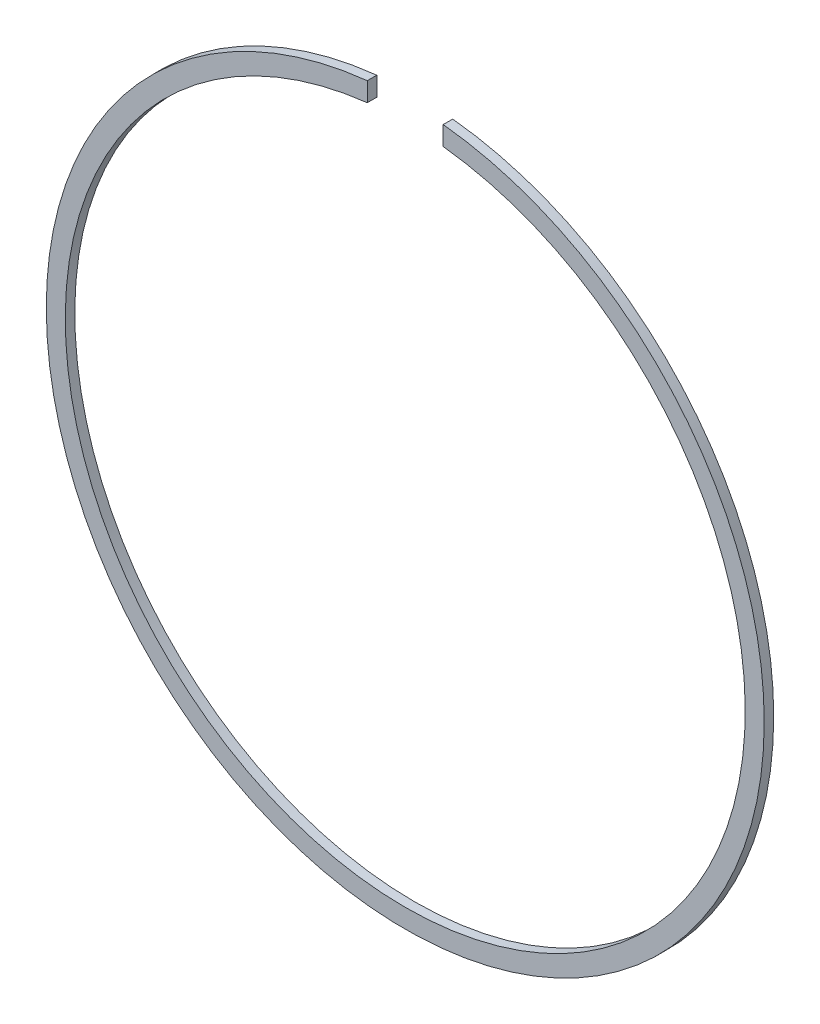
ISO-10303-21;
HEADER;
FILE_DESCRIPTION(('STEP AP214'),'2;1');
FILE_NAME('part.step','',(''),(''),'','','');
FILE_SCHEMA(('AUTOMOTIVE_DESIGN { 1 0 10303 214 1 1 1 1 }'));
ENDSEC;
DATA;
#1=APPLICATION_CONTEXT('core data for automotive mechanical design processes');
#2=APPLICATION_PROTOCOL_DEFINITION('international standard','automotive_design',2000,#1);
#3=PRODUCT_CONTEXT('',#1,'mechanical');
#4=PRODUCT('Part','Part','',(#3));
#5=PRODUCT_RELATED_PRODUCT_CATEGORY('part','',(#4));
#6=PRODUCT_DEFINITION_FORMATION('','',#4);
#7=PRODUCT_DEFINITION_CONTEXT('part definition',#1,'design');
#8=PRODUCT_DEFINITION('design','',#6,#7);
#9=PRODUCT_DEFINITION_SHAPE('','',#8);
#10=(LENGTH_UNIT() NAMED_UNIT(*) SI_UNIT(.MILLI.,.METRE.));
#11=(NAMED_UNIT(*) PLANE_ANGLE_UNIT() SI_UNIT($,.RADIAN.));
#12=(NAMED_UNIT(*) SI_UNIT($,.STERADIAN.) SOLID_ANGLE_UNIT());
#13=UNCERTAINTY_MEASURE_WITH_UNIT(LENGTH_MEASURE(1.E-05),#10,'distance_accuracy_value','');
#14=(GEOMETRIC_REPRESENTATION_CONTEXT(3) GLOBAL_UNCERTAINTY_ASSIGNED_CONTEXT((#13)) GLOBAL_UNIT_ASSIGNED_CONTEXT((#10,
#11,#12)) REPRESENTATION_CONTEXT('',''));
#15=CARTESIAN_POINT('',(0.,0.,0.));
#16=DIRECTION('',(0.,0.,1.));
#17=DIRECTION('',(1.,0.,0.));
#18=AXIS2_PLACEMENT_3D('',#15,#16,#17);
#19=CARTESIAN_POINT('',(2.,18.290899615,0.25));
#20=DIRECTION('',(1.,0.,0.));
#21=DIRECTION('',(0.,1.,0.));
#22=AXIS2_PLACEMENT_3D('',#19,#20,#21);
#23=PLANE('',#22);
#24=DIRECTION('',(5.695634942276E-10,-1.,0.));
#25=VECTOR('',#24,1.);
#26=CARTESIAN_POINT('',(1.999999999632,18.79388198295,0.));
#27=LINE('',#26,#25);
#28=CARTESIAN_POINT('',(1.999999999399,18.79388198331,0.));
#29=VERTEX_POINT('',#28);
#30=CARTESIAN_POINT('',(2.000000000205,17.78791724727,0.));
#31=VERTEX_POINT('',#30);
#32=EDGE_CURVE('E69',#29,#31,#27,.T.);
#33=ORIENTED_EDGE('',*,*,#32,.T.);
#34=DIRECTION('',(0.,0.,1.));
#35=VECTOR('',#34,1.);
#36=CARTESIAN_POINT('',(2.000000000205,17.78791724727,0.));
#37=LINE('',#36,#35);
#38=CARTESIAN_POINT('',(2.000000000291,17.78791724736,0.5));
#39=VERTEX_POINT('',#38);
#40=EDGE_CURVE('E11',#31,#39,#37,.T.);
#41=ORIENTED_EDGE('',*,*,#40,.T.);
#42=DIRECTION('',(5.69563935673E-10,-1.,0.));
#43=VECTOR('',#42,1.);
#44=CARTESIAN_POINT('',(1.999999999632,18.79388198297,0.5));
#45=LINE('',#44,#43);
#46=CARTESIAN_POINT('',(1.999999999399,18.79388198331,0.5));
#47=VERTEX_POINT('',#46);
#48=EDGE_CURVE('E27',#47,#39,#45,.T.);
#49=ORIENTED_EDGE('',*,*,#48,.F.);
#50=DIRECTION('',(0.,-3.780087354244E-11,-1.));
#51=VECTOR('',#50,1.);
#52=CARTESIAN_POINT('',(1.999999999632,18.79388198297,0.5));
#53=LINE('',#52,#51);
#54=EDGE_CURVE('E67',#47,#29,#53,.T.);
#55=ORIENTED_EDGE('',*,*,#54,.T.);
#56=EDGE_LOOP('',(#33,#41,#49,#55));
#57=FACE_BOUND('',#56,.T.);
#58=ADVANCED_FACE('F17',(#57),#23,.F.);
#59=CARTESIAN_POINT('',(0.,-0.05956264974822,0.5));
#60=DIRECTION('',(0.,0.,1.));
#61=DIRECTION('',(1.,0.,0.));
#62=AXIS2_PLACEMENT_3D('',#59,#60,#61);
#63=PLANE('',#62);
#64=CARTESIAN_POINT('',(0.,0.,0.5));
#65=DIRECTION('',(0.,0.,-1.));
#66=DIRECTION('',(-1.,4.55520560277E-11,0.));
#67=AXIS2_PLACEMENT_3D('',#64,#65,#66);
#68=CIRCLE('',#67,18.9);
#69=CARTESIAN_POINT('',(-2.00000000128,18.79388198265,0.5));
#70=VERTEX_POINT('',#69);
#71=EDGE_CURVE('E73',#47,#70,#68,.T.);
#72=ORIENTED_EDGE('',*,*,#71,.F.);
#73=ORIENTED_EDGE('',*,*,#48,.T.);
#74=CARTESIAN_POINT('',(0.,0.,0.5));
#75=DIRECTION('',(0.,0.,1.));
#76=DIRECTION('',(-1.,6.335535370704E-11,0.));
#77=AXIS2_PLACEMENT_3D('',#74,#75,#76);
#78=CIRCLE('',#77,17.9);
#79=CARTESIAN_POINT('',(-1.999999999121,17.78791724746,0.5));
#80=VERTEX_POINT('',#79);
#81=EDGE_CURVE('E40',#80,#39,#78,.T.);
#82=ORIENTED_EDGE('',*,*,#81,.F.);
#83=DIRECTION('',(-2.146078949012E-09,1.,0.));
#84=VECTOR('',#83,1.);
#85=CARTESIAN_POINT('',(-1.999999999121,17.78791724746,0.5));
#86=LINE('',#85,#84);
#87=EDGE_CURVE('E92',#80,#70,#86,.T.);
#88=ORIENTED_EDGE('',*,*,#87,.T.);
#89=EDGE_LOOP('',(#72,#73,#82,#88));
#90=FACE_BOUND('',#89,.T.);
#91=ADVANCED_FACE('F19',(#90),#63,.T.);
#92=CARTESIAN_POINT('',(0.,0.,0.5));
#93=DIRECTION('',(0.,0.,-1.));
#94=DIRECTION('',(-1.,0.,0.));
#95=AXIS2_PLACEMENT_3D('',#92,#93,#94);
#96=CYLINDRICAL_SURFACE('',#95,18.9);
#97=ORIENTED_EDGE('',*,*,#71,.T.);
#98=DIRECTION('',(0.,-2.911804131145E-11,1.));
#99=VECTOR('',#98,1.);
#100=CARTESIAN_POINT('',(-2.00000000128,18.79388198266,0.));
#101=LINE('',#100,#99);
#102=CARTESIAN_POINT('',(-2.00000000128,18.79388198266,0.));
#103=VERTEX_POINT('',#102);
#104=EDGE_CURVE('E80',#103,#70,#101,.T.);
#105=ORIENTED_EDGE('',*,*,#104,.F.);
#106=CARTESIAN_POINT('',(0.,0.,0.));
#107=DIRECTION('',(0.,0.,1.));
#108=DIRECTION('',(1.,-6.932067721106E-11,0.));
#109=AXIS2_PLACEMENT_3D('',#106,#107,#108);
#110=CIRCLE('',#109,18.9);
#111=EDGE_CURVE('E77',#103,#29,#110,.T.);
#112=ORIENTED_EDGE('',*,*,#111,.T.);
#113=ORIENTED_EDGE('',*,*,#54,.F.);
#114=EDGE_LOOP('',(#97,#105,#112,#113));
#115=FACE_BOUND('',#114,.T.);
#116=ADVANCED_FACE('F78',(#115),#96,.T.);
#117=CARTESIAN_POINT('',(0.,-0.05956264974822,0.));
#118=DIRECTION('',(0.,0.,1.));
#119=DIRECTION('',(1.,0.,0.));
#120=AXIS2_PLACEMENT_3D('',#117,#118,#119);
#121=PLANE('',#120);
#122=DIRECTION('',(-2.146078949017E-09,1.,0.));
#123=VECTOR('',#122,1.);
#124=CARTESIAN_POINT('',(-1.999999999121,17.78791724747,0.));
#125=LINE('',#124,#123);
#126=CARTESIAN_POINT('',(-1.999999999121,17.78791724747,0.));
#127=VERTEX_POINT('',#126);
#128=EDGE_CURVE('E86',#127,#103,#125,.T.);
#129=ORIENTED_EDGE('',*,*,#128,.F.);
#130=CARTESIAN_POINT('',(0.,0.,0.));
#131=DIRECTION('',(0.,0.,-1.));
#132=DIRECTION('',(1.,-3.905525460763E-11,0.));
#133=AXIS2_PLACEMENT_3D('',#130,#131,#132);
#134=CIRCLE('',#133,17.9);
#135=EDGE_CURVE('E59',#31,#127,#134,.T.);
#136=ORIENTED_EDGE('',*,*,#135,.F.);
#137=ORIENTED_EDGE('',*,*,#32,.F.);
#138=ORIENTED_EDGE('',*,*,#111,.F.);
#139=EDGE_LOOP('',(#129,#136,#137,#138));
#140=FACE_BOUND('',#139,.T.);
#141=ADVANCED_FACE('F84',(#140),#121,.F.);
#142=CARTESIAN_POINT('',(-2.,18.290899615,0.25));
#143=DIRECTION('',(1.,0.,0.));
#144=DIRECTION('',(0.,1.,0.));
#145=AXIS2_PLACEMENT_3D('',#142,#143,#144);
#146=PLANE('',#145);
#147=ORIENTED_EDGE('',*,*,#104,.T.);
#148=ORIENTED_EDGE('',*,*,#87,.F.);
#149=DIRECTION('',(0.,3.311839691378E-11,-1.));
#150=VECTOR('',#149,1.);
#151=CARTESIAN_POINT('',(-1.999999999121,17.78791724746,0.5));
#152=LINE('',#151,#150);
#153=EDGE_CURVE('E108',#80,#127,#152,.T.);
#154=ORIENTED_EDGE('',*,*,#153,.T.);
#155=ORIENTED_EDGE('',*,*,#128,.T.);
#156=EDGE_LOOP('',(#147,#148,#154,#155));
#157=FACE_BOUND('',#156,.T.);
#158=ADVANCED_FACE('F106',(#157),#146,.T.);
#159=CARTESIAN_POINT('',(0.,0.,0.5));
#160=DIRECTION('',(0.,0.,-1.));
#161=DIRECTION('',(-1.,0.,0.));
#162=AXIS2_PLACEMENT_3D('',#159,#160,#161);
#163=CYLINDRICAL_SURFACE('',#162,17.9);
#164=ORIENTED_EDGE('',*,*,#81,.T.);
#165=ORIENTED_EDGE('',*,*,#40,.F.);
#166=ORIENTED_EDGE('',*,*,#135,.T.);
#167=ORIENTED_EDGE('',*,*,#153,.F.);
#168=EDGE_LOOP('',(#164,#165,#166,#167));
#169=FACE_BOUND('',#168,.T.);
#170=ADVANCED_FACE('F138',(#169),#163,.F.);
#171=CLOSED_SHELL('',(#58,#91,#116,#141,#158,#170));
#172=MANIFOLD_SOLID_BREP('B1',#171);
#173=ADVANCED_BREP_SHAPE_REPRESENTATION('',(#18,#172),#14);
#174=SHAPE_DEFINITION_REPRESENTATION(#9,#173);
ENDSEC;
END-ISO-10303-21;
